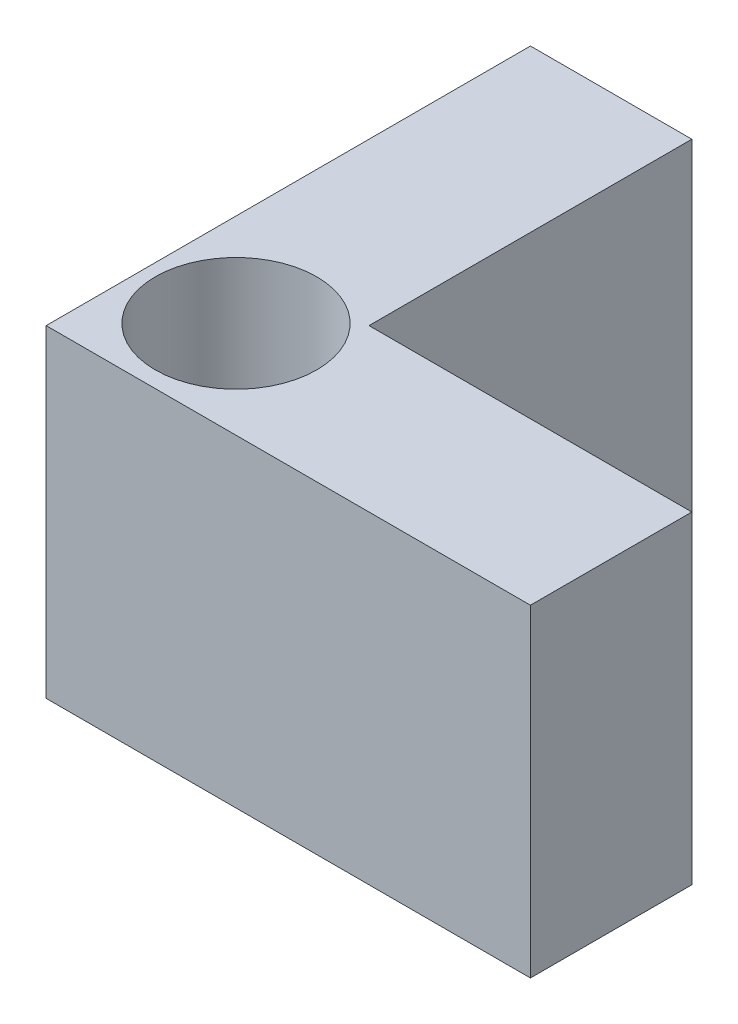
ISO-10303-21;
HEADER;
FILE_DESCRIPTION(('STEP AP214'),'2;1');
FILE_NAME('part.step','',(''),(''),'','','');
FILE_SCHEMA(('AUTOMOTIVE_DESIGN { 1 0 10303 214 1 1 1 1 }'));
ENDSEC;
DATA;
#1=APPLICATION_CONTEXT('core data for automotive mechanical design processes');
#2=APPLICATION_PROTOCOL_DEFINITION('international standard','automotive_design',2000,#1);
#3=PRODUCT_CONTEXT('',#1,'mechanical');
#4=PRODUCT('Part','Part','',(#3));
#5=PRODUCT_RELATED_PRODUCT_CATEGORY('part','',(#4));
#6=PRODUCT_DEFINITION_FORMATION('','',#4);
#7=PRODUCT_DEFINITION_CONTEXT('part definition',#1,'design');
#8=PRODUCT_DEFINITION('design','',#6,#7);
#9=PRODUCT_DEFINITION_SHAPE('','',#8);
#10=(LENGTH_UNIT() NAMED_UNIT(*) SI_UNIT(.MILLI.,.METRE.));
#11=(NAMED_UNIT(*) PLANE_ANGLE_UNIT() SI_UNIT($,.RADIAN.));
#12=(NAMED_UNIT(*) SI_UNIT($,.STERADIAN.) SOLID_ANGLE_UNIT());
#13=UNCERTAINTY_MEASURE_WITH_UNIT(LENGTH_MEASURE(1.E-05),#10,'distance_accuracy_value','');
#14=(GEOMETRIC_REPRESENTATION_CONTEXT(3) GLOBAL_UNCERTAINTY_ASSIGNED_CONTEXT((#13)) GLOBAL_UNIT_ASSIGNED_CONTEXT((#10,
#11,#12)) REPRESENTATION_CONTEXT('',''));
#15=CARTESIAN_POINT('',(0.,0.,0.));
#16=DIRECTION('',(0.,0.,1.));
#17=DIRECTION('',(1.,0.,0.));
#18=AXIS2_PLACEMENT_3D('',#15,#16,#17);
#19=CARTESIAN_POINT('',(0.,10.,0.));
#20=DIRECTION('',(0.,-1.,0.));
#21=DIRECTION('',(0.,0.,-1.));
#22=AXIS2_PLACEMENT_3D('',#19,#20,#21);
#23=PLANE('',#22);
#24=DIRECTION('',(0.,0.,-1.));
#25=VECTOR('',#24,1.);
#26=CARTESIAN_POINT('',(5.,10.,-5.));
#27=LINE('',#26,#25);
#28=CARTESIAN_POINT('',(5.,10.,-5.));
#29=VERTEX_POINT('',#28);
#30=CARTESIAN_POINT('',(5.,10.,-15.));
#31=VERTEX_POINT('',#30);
#32=EDGE_CURVE('E129',#29,#31,#27,.T.);
#33=ORIENTED_EDGE('',*,*,#32,.T.);
#34=DIRECTION('',(-1.,0.,0.));
#35=VECTOR('',#34,1.);
#36=CARTESIAN_POINT('',(0.,10.,-15.));
#37=LINE('',#36,#35);
#38=CARTESIAN_POINT('',(0.,10.,-15.));
#39=VERTEX_POINT('',#38);
#40=EDGE_CURVE('E87',#31,#39,#37,.T.);
#41=ORIENTED_EDGE('',*,*,#40,.T.);
#42=DIRECTION('',(0.,0.,1.));
#43=VECTOR('',#42,1.);
#44=CARTESIAN_POINT('',(0.,10.,-15.));
#45=LINE('',#44,#43);
#46=CARTESIAN_POINT('',(0.,10.,0.));
#47=VERTEX_POINT('',#46);
#48=EDGE_CURVE('E100',#39,#47,#45,.T.);
#49=ORIENTED_EDGE('',*,*,#48,.T.);
#50=DIRECTION('',(1.,0.,0.));
#51=VECTOR('',#50,1.);
#52=CARTESIAN_POINT('',(0.,10.,0.));
#53=LINE('',#52,#51);
#54=CARTESIAN_POINT('',(15.,10.,0.));
#55=VERTEX_POINT('',#54);
#56=EDGE_CURVE('E94',#47,#55,#53,.T.);
#57=ORIENTED_EDGE('',*,*,#56,.T.);
#58=DIRECTION('',(0.,0.,-1.));
#59=VECTOR('',#58,1.);
#60=CARTESIAN_POINT('',(15.,10.,0.));
#61=LINE('',#60,#59);
#62=CARTESIAN_POINT('',(15.,10.,-5.));
#63=VERTEX_POINT('',#62);
#64=EDGE_CURVE('E98',#55,#63,#61,.T.);
#65=ORIENTED_EDGE('',*,*,#64,.T.);
#66=DIRECTION('',(-1.,0.,0.));
#67=VECTOR('',#66,1.);
#68=CARTESIAN_POINT('',(5.,10.,-5.));
#69=LINE('',#68,#67);
#70=EDGE_CURVE('E50',#63,#29,#69,.T.);
#71=ORIENTED_EDGE('',*,*,#70,.T.);
#72=EDGE_LOOP('',(#33,#41,#49,#57,#65,#71));
#73=FACE_BOUND('',#72,.T.);
#74=CARTESIAN_POINT('',(2.87994854663509,10.,-3.00079319131008));
#75=DIRECTION('',(0.,1.,0.));
#76=DIRECTION('',(0.,0.,1.));
#77=AXIS2_PLACEMENT_3D('',#74,#75,#76);
#78=CIRCLE('',#77,2.5);
#79=CARTESIAN_POINT('',(2.87994854663509,10.,-0.50079319131008));
#80=VERTEX_POINT('',#79);
#81=EDGE_CURVE('E122',#80,#80,#78,.T.);
#82=ORIENTED_EDGE('',*,*,#81,.F.);
#83=EDGE_LOOP('',(#82));
#84=FACE_BOUND('',#83,.T.);
#85=ADVANCED_FACE('F33',(#73,#84),#23,.F.);
#86=CARTESIAN_POINT('',(0.,0.,0.));
#87=DIRECTION('',(0.,-1.,0.));
#88=DIRECTION('',(0.,0.,-1.));
#89=AXIS2_PLACEMENT_3D('',#86,#87,#88);
#90=PLANE('',#89);
#91=DIRECTION('',(0.,0.,-1.));
#92=VECTOR('',#91,1.);
#93=CARTESIAN_POINT('',(5.,0.,-5.));
#94=LINE('',#93,#92);
#95=CARTESIAN_POINT('',(5.,0.,-5.));
#96=VERTEX_POINT('',#95);
#97=CARTESIAN_POINT('',(5.,0.,-15.));
#98=VERTEX_POINT('',#97);
#99=EDGE_CURVE('E118',#96,#98,#94,.T.);
#100=ORIENTED_EDGE('',*,*,#99,.F.);
#101=DIRECTION('',(-1.,0.,0.));
#102=VECTOR('',#101,1.);
#103=CARTESIAN_POINT('',(5.,0.,-5.));
#104=LINE('',#103,#102);
#105=CARTESIAN_POINT('',(15.,0.,-5.));
#106=VERTEX_POINT('',#105);
#107=EDGE_CURVE('E79',#106,#96,#104,.T.);
#108=ORIENTED_EDGE('',*,*,#107,.F.);
#109=DIRECTION('',(0.,0.,-1.));
#110=VECTOR('',#109,1.);
#111=CARTESIAN_POINT('',(15.,0.,0.));
#112=LINE('',#111,#110);
#113=CARTESIAN_POINT('',(15.,0.,0.));
#114=VERTEX_POINT('',#113);
#115=EDGE_CURVE('E73',#114,#106,#112,.T.);
#116=ORIENTED_EDGE('',*,*,#115,.F.);
#117=DIRECTION('',(1.,0.,0.));
#118=VECTOR('',#117,1.);
#119=CARTESIAN_POINT('',(0.,0.,0.));
#120=LINE('',#119,#118);
#121=CARTESIAN_POINT('',(0.,0.,0.));
#122=VERTEX_POINT('',#121);
#123=EDGE_CURVE('E108',#122,#114,#120,.T.);
#124=ORIENTED_EDGE('',*,*,#123,.F.);
#125=DIRECTION('',(0.,0.,1.));
#126=VECTOR('',#125,1.);
#127=CARTESIAN_POINT('',(0.,0.,-15.));
#128=LINE('',#127,#126);
#129=CARTESIAN_POINT('',(0.,0.,-15.));
#130=VERTEX_POINT('',#129);
#131=EDGE_CURVE('E124',#130,#122,#128,.T.);
#132=ORIENTED_EDGE('',*,*,#131,.F.);
#133=DIRECTION('',(-1.,0.,0.));
#134=VECTOR('',#133,1.);
#135=CARTESIAN_POINT('',(0.,0.,-15.));
#136=LINE('',#135,#134);
#137=EDGE_CURVE('E121',#98,#130,#136,.T.);
#138=ORIENTED_EDGE('',*,*,#137,.F.);
#139=EDGE_LOOP('',(#100,#108,#116,#124,#132,#138));
#140=FACE_BOUND('',#139,.T.);
#141=CARTESIAN_POINT('',(2.87994854663509,0.,-3.00079319131008));
#142=DIRECTION('',(0.,1.,0.));
#143=DIRECTION('',(0.,0.,1.));
#144=AXIS2_PLACEMENT_3D('',#141,#142,#143);
#145=CIRCLE('',#144,2.5);
#146=CARTESIAN_POINT('',(2.87994854663509,0.,-0.50079319131008));
#147=VERTEX_POINT('',#146);
#148=EDGE_CURVE('E222',#147,#147,#145,.T.);
#149=ORIENTED_EDGE('',*,*,#148,.T.);
#150=EDGE_LOOP('',(#149));
#151=FACE_BOUND('',#150,.T.);
#152=ADVANCED_FACE('F138',(#140,#151),#90,.T.);
#153=CARTESIAN_POINT('',(5.,10.,-5.));
#154=DIRECTION('',(-1.,0.,0.));
#155=DIRECTION('',(0.,0.,1.));
#156=AXIS2_PLACEMENT_3D('',#153,#154,#155);
#157=PLANE('',#156);
#158=ORIENTED_EDGE('',*,*,#99,.T.);
#159=DIRECTION('',(0.,-1.,0.));
#160=VECTOR('',#159,1.);
#161=CARTESIAN_POINT('',(5.,10.,-15.));
#162=LINE('',#161,#160);
#163=EDGE_CURVE('E11',#31,#98,#162,.T.);
#164=ORIENTED_EDGE('',*,*,#163,.F.);
#165=ORIENTED_EDGE('',*,*,#32,.F.);
#166=DIRECTION('',(0.,-1.,0.));
#167=VECTOR('',#166,1.);
#168=CARTESIAN_POINT('',(5.,10.,-5.));
#169=LINE('',#168,#167);
#170=EDGE_CURVE('E114',#29,#96,#169,.T.);
#171=ORIENTED_EDGE('',*,*,#170,.T.);
#172=EDGE_LOOP('',(#158,#164,#165,#171));
#173=FACE_BOUND('',#172,.T.);
#174=ADVANCED_FACE('F35',(#173),#157,.F.);
#175=CARTESIAN_POINT('',(0.,10.,-15.));
#176=DIRECTION('',(0.,0.,1.));
#177=DIRECTION('',(1.,0.,0.));
#178=AXIS2_PLACEMENT_3D('',#175,#176,#177);
#179=PLANE('',#178);
#180=ORIENTED_EDGE('',*,*,#137,.T.);
#181=DIRECTION('',(0.,-1.,0.));
#182=VECTOR('',#181,1.);
#183=CARTESIAN_POINT('',(0.,10.,-15.));
#184=LINE('',#183,#182);
#185=EDGE_CURVE('E42',#39,#130,#184,.T.);
#186=ORIENTED_EDGE('',*,*,#185,.F.);
#187=ORIENTED_EDGE('',*,*,#40,.F.);
#188=ORIENTED_EDGE('',*,*,#163,.T.);
#189=EDGE_LOOP('',(#180,#186,#187,#188));
#190=FACE_BOUND('',#189,.T.);
#191=ADVANCED_FACE('F163',(#190),#179,.F.);
#192=CARTESIAN_POINT('',(0.,10.,-15.));
#193=DIRECTION('',(1.,0.,0.));
#194=DIRECTION('',(0.,0.,-1.));
#195=AXIS2_PLACEMENT_3D('',#192,#193,#194);
#196=PLANE('',#195);
#197=ORIENTED_EDGE('',*,*,#131,.T.);
#198=DIRECTION('',(0.,-1.,0.));
#199=VECTOR('',#198,1.);
#200=CARTESIAN_POINT('',(0.,10.,0.));
#201=LINE('',#200,#199);
#202=EDGE_CURVE('E109',#47,#122,#201,.T.);
#203=ORIENTED_EDGE('',*,*,#202,.F.);
#204=ORIENTED_EDGE('',*,*,#48,.F.);
#205=ORIENTED_EDGE('',*,*,#185,.T.);
#206=EDGE_LOOP('',(#197,#203,#204,#205));
#207=FACE_BOUND('',#206,.T.);
#208=ADVANCED_FACE('F135',(#207),#196,.F.);
#209=CARTESIAN_POINT('',(0.,10.,0.));
#210=DIRECTION('',(0.,0.,-1.));
#211=DIRECTION('',(-1.,0.,0.));
#212=AXIS2_PLACEMENT_3D('',#209,#210,#211);
#213=PLANE('',#212);
#214=ORIENTED_EDGE('',*,*,#123,.T.);
#215=DIRECTION('',(0.,-1.,0.));
#216=VECTOR('',#215,1.);
#217=CARTESIAN_POINT('',(15.,10.,0.));
#218=LINE('',#217,#216);
#219=EDGE_CURVE('E105',#55,#114,#218,.T.);
#220=ORIENTED_EDGE('',*,*,#219,.F.);
#221=ORIENTED_EDGE('',*,*,#56,.F.);
#222=ORIENTED_EDGE('',*,*,#202,.T.);
#223=EDGE_LOOP('',(#214,#220,#221,#222));
#224=FACE_BOUND('',#223,.T.);
#225=ADVANCED_FACE('F106',(#224),#213,.F.);
#226=CARTESIAN_POINT('',(15.,10.,0.));
#227=DIRECTION('',(-1.,0.,0.));
#228=DIRECTION('',(0.,0.,1.));
#229=AXIS2_PLACEMENT_3D('',#226,#227,#228);
#230=PLANE('',#229);
#231=ORIENTED_EDGE('',*,*,#115,.T.);
#232=DIRECTION('',(0.,-1.,0.));
#233=VECTOR('',#232,1.);
#234=CARTESIAN_POINT('',(15.,10.,-5.));
#235=LINE('',#234,#233);
#236=EDGE_CURVE('E110',#63,#106,#235,.T.);
#237=ORIENTED_EDGE('',*,*,#236,.F.);
#238=ORIENTED_EDGE('',*,*,#64,.F.);
#239=ORIENTED_EDGE('',*,*,#219,.T.);
#240=EDGE_LOOP('',(#231,#237,#238,#239));
#241=FACE_BOUND('',#240,.T.);
#242=ADVANCED_FACE('F112',(#241),#230,.F.);
#243=CARTESIAN_POINT('',(5.,10.,-5.));
#244=DIRECTION('',(0.,0.,1.));
#245=DIRECTION('',(1.,0.,0.));
#246=AXIS2_PLACEMENT_3D('',#243,#244,#245);
#247=PLANE('',#246);
#248=ORIENTED_EDGE('',*,*,#107,.T.);
#249=ORIENTED_EDGE('',*,*,#170,.F.);
#250=ORIENTED_EDGE('',*,*,#70,.F.);
#251=ORIENTED_EDGE('',*,*,#236,.T.);
#252=EDGE_LOOP('',(#248,#249,#250,#251));
#253=FACE_BOUND('',#252,.T.);
#254=ADVANCED_FACE('F143',(#253),#247,.F.);
#255=CARTESIAN_POINT('',(2.87994854663509,10.,-3.00079319131008));
#256=DIRECTION('',(0.,-1.,0.));
#257=DIRECTION('',(0.,0.,-1.));
#258=AXIS2_PLACEMENT_3D('',#255,#256,#257);
#259=CYLINDRICAL_SURFACE('',#258,2.5);
#260=ORIENTED_EDGE('',*,*,#81,.T.);
#261=EDGE_LOOP('',(#260));
#262=FACE_BOUND('',#261,.T.);
#263=ORIENTED_EDGE('',*,*,#148,.F.);
#264=EDGE_LOOP('',(#263));
#265=FACE_BOUND('',#264,.T.);
#266=ADVANCED_FACE('F145',(#262,#265),#259,.F.);
#267=CLOSED_SHELL('',(#85,#152,#174,#191,#208,#225,#242,#254,#266));
#268=MANIFOLD_SOLID_BREP('B2',#267);
#269=ADVANCED_BREP_SHAPE_REPRESENTATION('',(#18,#268),#14);
#270=SHAPE_DEFINITION_REPRESENTATION(#9,#269);
ENDSEC;
END-ISO-10303-21;
